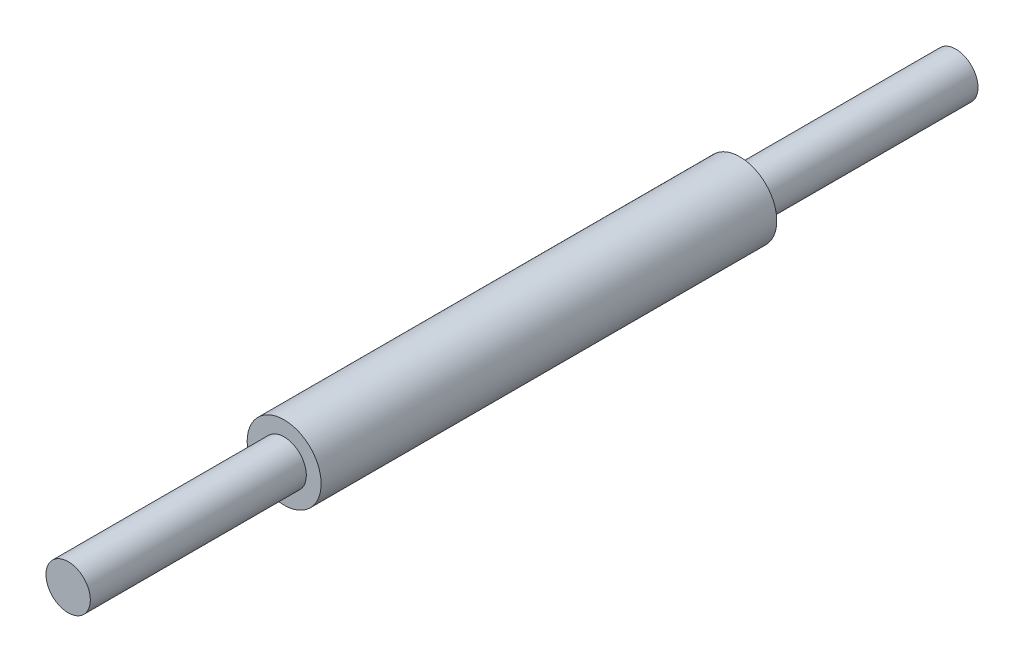
ISO-10303-21;
HEADER;
FILE_DESCRIPTION(('STEP AP214'),'2;1');
FILE_NAME('part.step','',(''),(''),'','','');
FILE_SCHEMA(('AUTOMOTIVE_DESIGN { 1 0 10303 214 1 1 1 1 }'));
ENDSEC;
DATA;
#1=APPLICATION_CONTEXT('core data for automotive mechanical design processes');
#2=APPLICATION_PROTOCOL_DEFINITION('international standard','automotive_design',2000,#1);
#3=PRODUCT_CONTEXT('',#1,'mechanical');
#4=PRODUCT('Part','Part','',(#3));
#5=PRODUCT_RELATED_PRODUCT_CATEGORY('part','',(#4));
#6=PRODUCT_DEFINITION_FORMATION('','',#4);
#7=PRODUCT_DEFINITION_CONTEXT('part definition',#1,'design');
#8=PRODUCT_DEFINITION('design','',#6,#7);
#9=PRODUCT_DEFINITION_SHAPE('','',#8);
#10=(LENGTH_UNIT() NAMED_UNIT(*) SI_UNIT(.MILLI.,.METRE.));
#11=(NAMED_UNIT(*) PLANE_ANGLE_UNIT() SI_UNIT($,.RADIAN.));
#12=(NAMED_UNIT(*) SI_UNIT($,.STERADIAN.) SOLID_ANGLE_UNIT());
#13=UNCERTAINTY_MEASURE_WITH_UNIT(LENGTH_MEASURE(1.E-05),#10,'distance_accuracy_value','');
#14=(GEOMETRIC_REPRESENTATION_CONTEXT(3) GLOBAL_UNCERTAINTY_ASSIGNED_CONTEXT((#13)) GLOBAL_UNIT_ASSIGNED_CONTEXT((#10,
#11,#12)) REPRESENTATION_CONTEXT('',''));
#15=CARTESIAN_POINT('',(0.,0.,0.));
#16=DIRECTION('',(0.,0.,1.));
#17=DIRECTION('',(1.,0.,0.));
#18=AXIS2_PLACEMENT_3D('',#15,#16,#17);
#19=CARTESIAN_POINT('',(0.,0.,15.4));
#20=DIRECTION('',(0.,0.,-1.));
#21=DIRECTION('',(-1.,0.,0.));
#22=AXIS2_PLACEMENT_3D('',#19,#20,#21);
#23=CYLINDRICAL_SURFACE('',#22,2.5);
#24=CARTESIAN_POINT('',(0.,0.,15.4));
#25=DIRECTION('',(0.,0.,1.));
#26=DIRECTION('',(1.,0.,0.));
#27=AXIS2_PLACEMENT_3D('',#24,#25,#26);
#28=CIRCLE('',#27,2.5);
#29=CARTESIAN_POINT('',(-2.5,0.,15.4));
#30=VERTEX_POINT('',#29);
#31=EDGE_CURVE('E43',#30,#30,#28,.T.);
#32=CARTESIAN_POINT('',(0.,0.,-15.4));
#33=DIRECTION('',(0.,0.,1.));
#34=DIRECTION('',(1.,0.,0.));
#35=AXIS2_PLACEMENT_3D('',#32,#33,#34);
#36=CIRCLE('',#35,2.5);
#37=CARTESIAN_POINT('',(-2.5,0.,-15.4));
#38=VERTEX_POINT('',#37);
#39=EDGE_CURVE('E50',#38,#38,#36,.T.);
#40=CARTESIAN_POINT('',(-2.5,0.,15.4));
#41=CARTESIAN_POINT('',(-2.5,0.,15.0791666666667));
#42=CARTESIAN_POINT('',(-2.5,0.,14.7583333333333));
#43=CARTESIAN_POINT('',(-2.5,0.,14.1166666666667));
#44=CARTESIAN_POINT('',(-2.5,0.,13.7958333333333));
#45=CARTESIAN_POINT('',(-2.5,0.,13.1541666666667));
#46=CARTESIAN_POINT('',(-2.5,0.,12.8333333333333));
#47=CARTESIAN_POINT('',(-2.5,0.,12.1916666666667));
#48=CARTESIAN_POINT('',(-2.5,0.,11.8708333333333));
#49=CARTESIAN_POINT('',(-2.5,0.,11.2291666666667));
#50=CARTESIAN_POINT('',(-2.5,0.,10.9083333333333));
#51=CARTESIAN_POINT('',(-2.5,0.,10.2666666666667));
#52=CARTESIAN_POINT('',(-2.5,0.,9.94583333333333));
#53=CARTESIAN_POINT('',(-2.5,0.,9.30416666666667));
#54=CARTESIAN_POINT('',(-2.5,0.,8.98333333333333));
#55=CARTESIAN_POINT('',(-2.5,0.,8.34166666666667));
#56=CARTESIAN_POINT('',(-2.5,0.,8.02083333333333));
#57=CARTESIAN_POINT('',(-2.5,0.,7.37916666666667));
#58=CARTESIAN_POINT('',(-2.5,0.,7.05833333333333));
#59=CARTESIAN_POINT('',(-2.5,0.,6.41666666666667));
#60=CARTESIAN_POINT('',(-2.5,0.,6.09583333333333));
#61=CARTESIAN_POINT('',(-2.5,0.,5.45416666666667));
#62=CARTESIAN_POINT('',(-2.5,0.,5.13333333333333));
#63=CARTESIAN_POINT('',(-2.5,0.,4.49166666666667));
#64=CARTESIAN_POINT('',(-2.5,0.,4.17083333333333));
#65=CARTESIAN_POINT('',(-2.5,0.,3.52916666666667));
#66=CARTESIAN_POINT('',(-2.5,0.,3.20833333333333));
#67=CARTESIAN_POINT('',(-2.5,0.,2.56666666666667));
#68=CARTESIAN_POINT('',(-2.5,0.,2.24583333333333));
#69=CARTESIAN_POINT('',(-2.5,0.,1.60416666666666));
#70=CARTESIAN_POINT('',(-2.5,0.,1.28333333333333));
#71=CARTESIAN_POINT('',(-2.5,0.,0.641666666666665));
#72=CARTESIAN_POINT('',(-2.5,0.,0.320833333333332));
#73=CARTESIAN_POINT('',(-2.5,0.,-0.320833333333335));
#74=CARTESIAN_POINT('',(-2.5,0.,-0.641666666666668));
#75=CARTESIAN_POINT('',(-2.5,0.,-1.28333333333333));
#76=CARTESIAN_POINT('',(-2.5,0.,-1.60416666666667));
#77=CARTESIAN_POINT('',(-2.5,0.,-2.24583333333333));
#78=CARTESIAN_POINT('',(-2.5,0.,-2.56666666666667));
#79=CARTESIAN_POINT('',(-2.5,0.,-3.20833333333333));
#80=CARTESIAN_POINT('',(-2.5,0.,-3.52916666666667));
#81=CARTESIAN_POINT('',(-2.5,0.,-4.17083333333333));
#82=CARTESIAN_POINT('',(-2.5,0.,-4.49166666666667));
#83=CARTESIAN_POINT('',(-2.5,0.,-5.13333333333333));
#84=CARTESIAN_POINT('',(-2.5,0.,-5.45416666666667));
#85=CARTESIAN_POINT('',(-2.5,0.,-6.09583333333333));
#86=CARTESIAN_POINT('',(-2.5,0.,-6.41666666666667));
#87=CARTESIAN_POINT('',(-2.5,0.,-7.05833333333333));
#88=CARTESIAN_POINT('',(-2.5,0.,-7.37916666666667));
#89=CARTESIAN_POINT('',(-2.5,0.,-8.02083333333334));
#90=CARTESIAN_POINT('',(-2.5,0.,-8.34166666666667));
#91=CARTESIAN_POINT('',(-2.5,0.,-8.98333333333334));
#92=CARTESIAN_POINT('',(-2.5,0.,-9.30416666666667));
#93=CARTESIAN_POINT('',(-2.5,0.,-9.94583333333334));
#94=CARTESIAN_POINT('',(-2.5,0.,-10.2666666666667));
#95=CARTESIAN_POINT('',(-2.5,0.,-10.9083333333333));
#96=CARTESIAN_POINT('',(-2.5,0.,-11.2291666666667));
#97=CARTESIAN_POINT('',(-2.5,0.,-11.8708333333333));
#98=CARTESIAN_POINT('',(-2.5,0.,-12.1916666666667));
#99=CARTESIAN_POINT('',(-2.5,0.,-12.8333333333333));
#100=CARTESIAN_POINT('',(-2.5,0.,-13.1541666666667));
#101=CARTESIAN_POINT('',(-2.5,0.,-13.7958333333333));
#102=CARTESIAN_POINT('',(-2.5,0.,-14.1166666666667));
#103=CARTESIAN_POINT('',(-2.5,0.,-14.7583333333333));
#104=CARTESIAN_POINT('',(-2.5,0.,-15.0791666666667));
#105=CARTESIAN_POINT('',(-2.5,0.,-15.4));
#106=B_SPLINE_CURVE_WITH_KNOTS('',3,(#40,#41,#42,#43,#44,#45,#46,#47,#48,#49,#50,#51,#52,#53,
#54,#55,#56,#57,#58,#59,#60,#61,#62,#63,#64,#65,#66,#67,#68,#69,#70,#71,#72,#73,#74,#75,#76,#77,
#78,#79,#80,#81,#82,#83,#84,#85,#86,#87,#88,#89,#90,#91,#92,#93,#94,#95,#96,#97,#98,#99,#100,
#101,#102,#103,#104,#105),.UNSPECIFIED.,.F.,.F.,(4,2,2,2,2,2,2,2,2,2,2,2,2,2,2,2,2,2,2,2,2,2,2,
2,2,2,2,2,2,2,2,2,4),(0.,0.962500000000002,1.925,2.8875,3.85,4.8125,5.775,6.7375,7.7,8.6625,
9.625,10.5875,11.55,12.5125,13.475,14.4375,15.4,16.3625,17.325,18.2875,19.25,20.2125,21.175,
22.1375,23.1,24.0625,25.025,25.9875,26.95,27.9125,28.875,29.8375,30.8),.UNSPECIFIED.);
#107=EDGE_CURVE('BSEAM40',#30,#38,#106,.T.);
#108=ORIENTED_EDGE('',*,*,#31,.F.);
#109=ORIENTED_EDGE('',*,*,#39,.T.);
#110=ORIENTED_EDGE('',*,*,#107,.T.);
#111=ORIENTED_EDGE('',*,*,#107,.F.);
#112=EDGE_LOOP('',(#108,#110,#109,#111));
#113=FACE_BOUND('',#112,.T.);
#114=ADVANCED_FACE('F40',(#113),#23,.T.);
#115=CARTESIAN_POINT('',(0.,0.,15.4));
#116=DIRECTION('',(0.,0.,1.));
#117=DIRECTION('',(1.,0.,0.));
#118=AXIS2_PLACEMENT_3D('',#115,#116,#117);
#119=PLANE('',#118);
#120=CARTESIAN_POINT('',(0.,0.,15.4));
#121=DIRECTION('',(0.,0.,1.));
#122=DIRECTION('',(1.,0.,0.));
#123=AXIS2_PLACEMENT_3D('',#120,#121,#122);
#124=CIRCLE('',#123,1.5);
#125=CARTESIAN_POINT('',(1.5,0.,15.4));
#126=VERTEX_POINT('',#125);
#127=EDGE_CURVE('E55',#126,#126,#124,.F.);
#128=ORIENTED_EDGE('',*,*,#127,.T.);
#129=EDGE_LOOP('',(#128));
#130=FACE_BOUND('',#129,.T.);
#131=ORIENTED_EDGE('',*,*,#31,.T.);
#132=EDGE_LOOP('',(#131));
#133=FACE_BOUND('',#132,.T.);
#134=ADVANCED_FACE('F83',(#130,#133),#119,.T.);
#135=CARTESIAN_POINT('',(0.,0.,-15.4));
#136=DIRECTION('',(0.,0.,1.));
#137=DIRECTION('',(1.,0.,0.));
#138=AXIS2_PLACEMENT_3D('',#135,#136,#137);
#139=PLANE('',#138);
#140=CARTESIAN_POINT('',(0.,0.,-15.4));
#141=DIRECTION('',(0.,0.,1.));
#142=DIRECTION('',(1.,0.,0.));
#143=AXIS2_PLACEMENT_3D('',#140,#141,#142);
#144=CIRCLE('',#143,1.5);
#145=CARTESIAN_POINT('',(1.5,0.,-15.4));
#146=VERTEX_POINT('',#145);
#147=EDGE_CURVE('E10',#146,#146,#144,.F.);
#148=ORIENTED_EDGE('',*,*,#147,.F.);
#149=EDGE_LOOP('',(#148));
#150=FACE_BOUND('',#149,.T.);
#151=ORIENTED_EDGE('',*,*,#39,.F.);
#152=EDGE_LOOP('',(#151));
#153=FACE_BOUND('',#152,.T.);
#154=ADVANCED_FACE('F88',(#150,#153),#139,.F.);
#155=CARTESIAN_POINT('',(0.,0.,-30.));
#156=DIRECTION('',(0.,0.,1.));
#157=DIRECTION('',(1.,0.,0.));
#158=AXIS2_PLACEMENT_3D('',#155,#156,#157);
#159=PLANE('',#158);
#160=CARTESIAN_POINT('',(0.,0.,-30.));
#161=DIRECTION('',(0.,0.,1.));
#162=DIRECTION('',(1.,0.,0.));
#163=AXIS2_PLACEMENT_3D('',#160,#161,#162);
#164=CIRCLE('',#163,1.5);
#165=CARTESIAN_POINT('',(1.5,0.,-30.));
#166=VERTEX_POINT('',#165);
#167=EDGE_CURVE('E60',#166,#166,#164,.T.);
#168=ORIENTED_EDGE('',*,*,#167,.F.);
#169=EDGE_LOOP('',(#168));
#170=FACE_BOUND('',#169,.T.);
#171=ADVANCED_FACE('F73',(#170),#159,.F.);
#172=CARTESIAN_POINT('',(0.,0.,30.));
#173=DIRECTION('',(0.,0.,-1.));
#174=DIRECTION('',(-1.,0.,0.));
#175=AXIS2_PLACEMENT_3D('',#172,#173,#174);
#176=CYLINDRICAL_SURFACE('',#175,1.5);
#177=ORIENTED_EDGE('',*,*,#167,.T.);
#178=EDGE_LOOP('',(#177));
#179=FACE_BOUND('',#178,.T.);
#180=ORIENTED_EDGE('',*,*,#147,.T.);
#181=EDGE_LOOP('',(#180));
#182=FACE_BOUND('',#181,.T.);
#183=ADVANCED_FACE('F69',(#179,#182),#176,.T.);
#184=ORIENTED_EDGE('',*,*,#127,.F.);
#185=EDGE_LOOP('',(#184));
#186=FACE_BOUND('',#185,.T.);
#187=CARTESIAN_POINT('',(0.,0.,30.));
#188=DIRECTION('',(0.,0.,1.));
#189=DIRECTION('',(1.,0.,0.));
#190=AXIS2_PLACEMENT_3D('',#187,#188,#189);
#191=CIRCLE('',#190,1.5);
#192=CARTESIAN_POINT('',(1.5,0.,30.));
#193=VERTEX_POINT('',#192);
#194=EDGE_CURVE('E57',#193,#193,#191,.T.);
#195=ORIENTED_EDGE('',*,*,#194,.F.);
#196=EDGE_LOOP('',(#195));
#197=FACE_BOUND('',#196,.T.);
#198=ADVANCED_FACE('F64',(#186,#197),#176,.T.);
#199=CARTESIAN_POINT('',(0.,0.,30.));
#200=DIRECTION('',(0.,0.,1.));
#201=DIRECTION('',(1.,0.,0.));
#202=AXIS2_PLACEMENT_3D('',#199,#200,#201);
#203=PLANE('',#202);
#204=ORIENTED_EDGE('',*,*,#194,.T.);
#205=EDGE_LOOP('',(#204));
#206=FACE_BOUND('',#205,.T.);
#207=ADVANCED_FACE('F62',(#206),#203,.T.);
#208=CLOSED_SHELL('',(#114,#134,#154,#171,#183,#198,#207));
#209=MANIFOLD_SOLID_BREP('B2',#208);
#210=ADVANCED_BREP_SHAPE_REPRESENTATION('',(#18,#209),#14);
#211=SHAPE_DEFINITION_REPRESENTATION(#9,#210);
ENDSEC;
END-ISO-10303-21;
